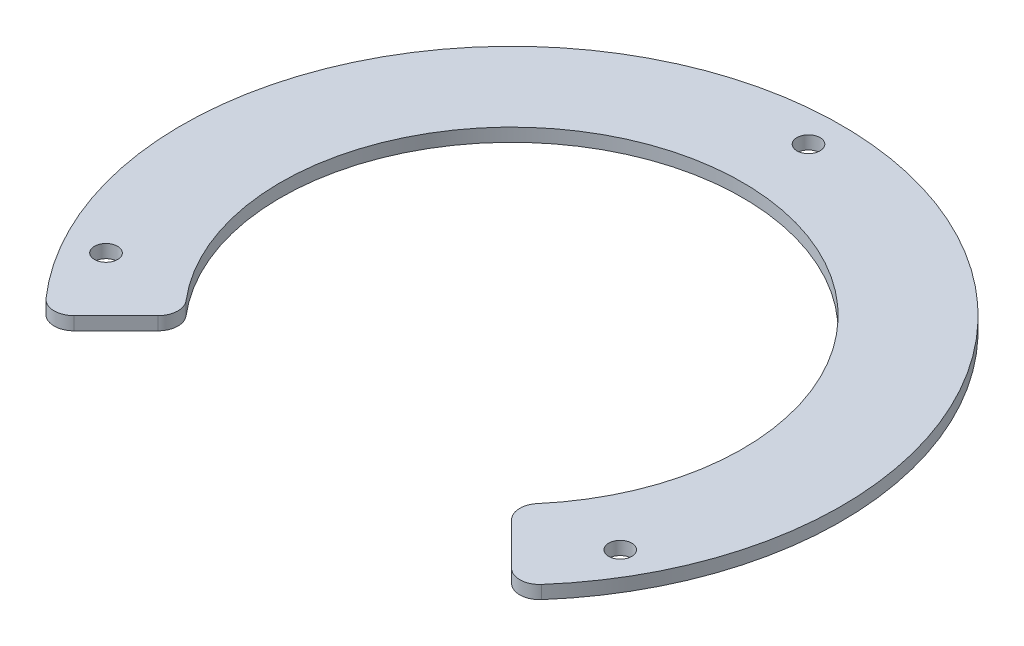
ISO-10303-21;
HEADER;
FILE_DESCRIPTION(('STEP AP214'),'2;1');
FILE_NAME('part.step','',(''),(''),'','','');
FILE_SCHEMA(('AUTOMOTIVE_DESIGN { 1 0 10303 214 1 1 1 1 }'));
ENDSEC;
DATA;
#1=APPLICATION_CONTEXT('core data for automotive mechanical design processes');
#2=APPLICATION_PROTOCOL_DEFINITION('international standard','automotive_design',2000,#1);
#3=PRODUCT_CONTEXT('',#1,'mechanical');
#4=PRODUCT('Part','Part','',(#3));
#5=PRODUCT_RELATED_PRODUCT_CATEGORY('part','',(#4));
#6=PRODUCT_DEFINITION_FORMATION('','',#4);
#7=PRODUCT_DEFINITION_CONTEXT('part definition',#1,'design');
#8=PRODUCT_DEFINITION('design','',#6,#7);
#9=PRODUCT_DEFINITION_SHAPE('','',#8);
#10=(LENGTH_UNIT() NAMED_UNIT(*) SI_UNIT(.MILLI.,.METRE.));
#11=(NAMED_UNIT(*) PLANE_ANGLE_UNIT() SI_UNIT($,.RADIAN.));
#12=(NAMED_UNIT(*) SI_UNIT($,.STERADIAN.) SOLID_ANGLE_UNIT());
#13=UNCERTAINTY_MEASURE_WITH_UNIT(LENGTH_MEASURE(1.E-05),#10,'distance_accuracy_value','');
#14=(GEOMETRIC_REPRESENTATION_CONTEXT(3) GLOBAL_UNCERTAINTY_ASSIGNED_CONTEXT((#13)) GLOBAL_UNIT_ASSIGNED_CONTEXT((#10,
#11,#12)) REPRESENTATION_CONTEXT('',''));
#15=CARTESIAN_POINT('',(0.,0.,0.));
#16=DIRECTION('',(0.,0.,1.));
#17=DIRECTION('',(1.,0.,0.));
#18=AXIS2_PLACEMENT_3D('',#15,#16,#17);
#19=CARTESIAN_POINT('',(0.,2.,0.));
#20=DIRECTION('',(0.,1.,0.));
#21=DIRECTION('',(0.,0.,1.));
#22=AXIS2_PLACEMENT_3D('',#19,#20,#21);
#23=PLANE('',#22);
#24=DIRECTION('',(-0.707106781186546,0.,0.707106781186549));
#25=VECTOR('',#24,1.);
#26=CARTESIAN_POINT('',(0.,2.,0.));
#27=LINE('',#26,#25);
#28=CARTESIAN_POINT('',(-26.7861904719577,2.,26.7861904719578));
#29=VERTEX_POINT('',#28);
#30=CARTESIAN_POINT('',(-33.166247903554,2.,33.1662479035541));
#31=VERTEX_POINT('',#30);
#32=EDGE_CURVE('E121',#29,#31,#27,.T.);
#33=ORIENTED_EDGE('',*,*,#32,.F.);
#34=CARTESIAN_POINT('',(-28.9075108155174,2.,24.6648701283982));
#35=DIRECTION('',(0.,1.,0.));
#36=DIRECTION('',(0.,0.,1.));
#37=AXIS2_PLACEMENT_3D('',#34,#35,#36);
#38=CIRCLE('',#37,3.);
#39=CARTESIAN_POINT('',(-26.6253389090291,2.,22.7176435393141));
#40=VERTEX_POINT('',#39);
#41=EDGE_CURVE('E124',#29,#40,#38,.T.);
#42=ORIENTED_EDGE('',*,*,#41,.T.);
#43=CARTESIAN_POINT('',(0.,2.,0.));
#44=DIRECTION('',(0.,1.,0.));
#45=DIRECTION('',(0.,0.,1.));
#46=AXIS2_PLACEMENT_3D('',#43,#44,#45);
#47=CIRCLE('',#46,35.);
#48=CARTESIAN_POINT('',(26.6253389090291,2.,22.7176435393141));
#49=VERTEX_POINT('',#48);
#50=EDGE_CURVE('E176',#49,#40,#47,.T.);
#51=ORIENTED_EDGE('',*,*,#50,.F.);
#52=CARTESIAN_POINT('',(28.9075108155174,2.,24.6648701283982));
#53=DIRECTION('',(0.,1.,0.));
#54=DIRECTION('',(0.,0.,1.));
#55=AXIS2_PLACEMENT_3D('',#52,#53,#54);
#56=CIRCLE('',#55,3.);
#57=CARTESIAN_POINT('',(26.7861904719577,2.,26.7861904719578));
#58=VERTEX_POINT('',#57);
#59=EDGE_CURVE('E125',#49,#58,#56,.T.);
#60=ORIENTED_EDGE('',*,*,#59,.T.);
#61=DIRECTION('',(-0.707106781186546,0.,-0.707106781186549));
#62=VECTOR('',#61,1.);
#63=CARTESIAN_POINT('',(49.9999999999998,2.,50.));
#64=LINE('',#63,#62);
#65=CARTESIAN_POINT('',(33.1662479035539,2.,33.1662479035541));
#66=VERTEX_POINT('',#65);
#67=EDGE_CURVE('E153',#66,#58,#64,.T.);
#68=ORIENTED_EDGE('',*,*,#67,.F.);
#69=CARTESIAN_POINT('',(35.2875682471136,2.,31.0449275599944));
#70=DIRECTION('',(0.,1.,0.));
#71=DIRECTION('',(0.,0.,1.));
#72=AXIS2_PLACEMENT_3D('',#69,#70,#71);
#73=CIRCLE('',#72,3.);
#74=CARTESIAN_POINT('',(37.5399662203336,2.,33.0265186808451));
#75=VERTEX_POINT('',#74);
#76=EDGE_CURVE('E127',#66,#75,#73,.T.);
#77=ORIENTED_EDGE('',*,*,#76,.T.);
#78=CARTESIAN_POINT('',(0.,2.,0.));
#79=DIRECTION('',(0.,1.,0.));
#80=DIRECTION('',(0.,0.,1.));
#81=AXIS2_PLACEMENT_3D('',#78,#79,#80);
#82=CIRCLE('',#81,50.);
#83=CARTESIAN_POINT('',(-37.5399662203336,2.,33.0265186808451));
#84=VERTEX_POINT('',#83);
#85=EDGE_CURVE('E129',#75,#84,#82,.T.);
#86=ORIENTED_EDGE('',*,*,#85,.T.);
#87=CARTESIAN_POINT('',(-35.2875682471136,2.,31.0449275599944));
#88=DIRECTION('',(0.,1.,0.));
#89=DIRECTION('',(0.,0.,1.));
#90=AXIS2_PLACEMENT_3D('',#87,#88,#89);
#91=CIRCLE('',#90,3.);
#92=EDGE_CURVE('E134',#84,#31,#91,.T.);
#93=ORIENTED_EDGE('',*,*,#92,.T.);
#94=EDGE_LOOP('',(#33,#42,#51,#60,#68,#77,#86,#93));
#95=FACE_BOUND('',#94,.T.);
#96=CARTESIAN_POINT('',(38.9711431703026,2.,22.4999999999983));
#97=DIRECTION('',(0.,1.,0.));
#98=DIRECTION('',(0.,0.,1.));
#99=AXIS2_PLACEMENT_3D('',#96,#97,#98);
#100=CIRCLE('',#99,1.75000000000246);
#101=CARTESIAN_POINT('',(38.9711431703026,2.,24.2500000000008));
#102=VERTEX_POINT('',#101);
#103=EDGE_CURVE('E165',#102,#102,#100,.T.);
#104=ORIENTED_EDGE('',*,*,#103,.F.);
#105=EDGE_LOOP('',(#104));
#106=FACE_BOUND('',#105,.T.);
#107=CARTESIAN_POINT('',(0.,2.,-45.));
#108=DIRECTION('',(0.,1.,0.));
#109=DIRECTION('',(0.,0.,1.));
#110=AXIS2_PLACEMENT_3D('',#107,#108,#109);
#111=CIRCLE('',#110,1.75);
#112=CARTESIAN_POINT('',(0.,2.,-43.25));
#113=VERTEX_POINT('',#112);
#114=EDGE_CURVE('E171',#113,#113,#111,.T.);
#115=ORIENTED_EDGE('',*,*,#114,.F.);
#116=EDGE_LOOP('',(#115));
#117=FACE_BOUND('',#116,.T.);
#118=CARTESIAN_POINT('',(-38.9711431702969,2.,22.5000000000017));
#119=DIRECTION('',(0.,1.,0.));
#120=DIRECTION('',(0.,0.,1.));
#121=AXIS2_PLACEMENT_3D('',#118,#119,#120);
#122=CIRCLE('',#121,1.75000000000364);
#123=CARTESIAN_POINT('',(-38.9711431702969,2.,24.2500000000053));
#124=VERTEX_POINT('',#123);
#125=EDGE_CURVE('E158',#124,#124,#122,.T.);
#126=ORIENTED_EDGE('',*,*,#125,.F.);
#127=EDGE_LOOP('',(#126));
#128=FACE_BOUND('',#127,.T.);
#129=ADVANCED_FACE('F32',(#95,#106,#117,#128),#23,.T.);
#130=CARTESIAN_POINT('',(0.,0.,0.));
#131=DIRECTION('',(0.,1.,0.));
#132=DIRECTION('',(0.,0.,1.));
#133=AXIS2_PLACEMENT_3D('',#130,#131,#132);
#134=PLANE('',#133);
#135=CARTESIAN_POINT('',(0.,0.,0.));
#136=DIRECTION('',(0.,1.,0.));
#137=DIRECTION('',(0.,0.,1.));
#138=AXIS2_PLACEMENT_3D('',#135,#136,#137);
#139=CIRCLE('',#138,35.);
#140=CARTESIAN_POINT('',(26.6253389090291,0.,22.7176435393141));
#141=VERTEX_POINT('',#140);
#142=CARTESIAN_POINT('',(-26.6253389090291,0.,22.7176435393141));
#143=VERTEX_POINT('',#142);
#144=EDGE_CURVE('E105',#141,#143,#139,.T.);
#145=ORIENTED_EDGE('',*,*,#144,.T.);
#146=CARTESIAN_POINT('',(-28.9075108155174,0.,24.6648701283982));
#147=DIRECTION('',(0.,1.,0.));
#148=DIRECTION('',(0.,0.,1.));
#149=AXIS2_PLACEMENT_3D('',#146,#147,#148);
#150=CIRCLE('',#149,3.);
#151=CARTESIAN_POINT('',(-26.7861904719577,0.,26.7861904719578));
#152=VERTEX_POINT('',#151);
#153=EDGE_CURVE('E98',#143,#152,#150,.F.);
#154=ORIENTED_EDGE('',*,*,#153,.T.);
#155=DIRECTION('',(-0.707106781186546,0.,0.707106781186549));
#156=VECTOR('',#155,1.);
#157=CARTESIAN_POINT('',(0.,0.,0.));
#158=LINE('',#157,#156);
#159=CARTESIAN_POINT('',(-33.166247903554,0.,33.1662479035541));
#160=VERTEX_POINT('',#159);
#161=EDGE_CURVE('E102',#152,#160,#158,.T.);
#162=ORIENTED_EDGE('',*,*,#161,.T.);
#163=CARTESIAN_POINT('',(-35.2875682471136,0.,31.0449275599944));
#164=DIRECTION('',(0.,1.,0.));
#165=DIRECTION('',(0.,0.,1.));
#166=AXIS2_PLACEMENT_3D('',#163,#164,#165);
#167=CIRCLE('',#166,3.);
#168=CARTESIAN_POINT('',(-37.5399662203336,0.,33.0265186808451));
#169=VERTEX_POINT('',#168);
#170=EDGE_CURVE('E110',#160,#169,#167,.F.);
#171=ORIENTED_EDGE('',*,*,#170,.T.);
#172=CARTESIAN_POINT('',(0.,0.,0.));
#173=DIRECTION('',(0.,1.,0.));
#174=DIRECTION('',(0.,0.,1.));
#175=AXIS2_PLACEMENT_3D('',#172,#173,#174);
#176=CIRCLE('',#175,50.);
#177=CARTESIAN_POINT('',(37.5399662203336,0.,33.0265186808451));
#178=VERTEX_POINT('',#177);
#179=EDGE_CURVE('E179',#178,#169,#176,.T.);
#180=ORIENTED_EDGE('',*,*,#179,.F.);
#181=CARTESIAN_POINT('',(35.2875682471136,0.,31.0449275599944));
#182=DIRECTION('',(0.,1.,0.));
#183=DIRECTION('',(0.,0.,1.));
#184=AXIS2_PLACEMENT_3D('',#181,#182,#183);
#185=CIRCLE('',#184,3.);
#186=CARTESIAN_POINT('',(33.166247903554,0.,33.1662479035541));
#187=VERTEX_POINT('',#186);
#188=EDGE_CURVE('E55',#178,#187,#185,.F.);
#189=ORIENTED_EDGE('',*,*,#188,.T.);
#190=DIRECTION('',(-0.707106781186546,0.,-0.707106781186549));
#191=VECTOR('',#190,1.);
#192=CARTESIAN_POINT('',(0.,0.,0.));
#193=LINE('',#192,#191);
#194=CARTESIAN_POINT('',(26.7861904719577,0.,26.7861904719578));
#195=VERTEX_POINT('',#194);
#196=EDGE_CURVE('E120',#187,#195,#193,.T.);
#197=ORIENTED_EDGE('',*,*,#196,.T.);
#198=CARTESIAN_POINT('',(28.9075108155174,0.,24.6648701283982));
#199=DIRECTION('',(0.,1.,0.));
#200=DIRECTION('',(0.,0.,1.));
#201=AXIS2_PLACEMENT_3D('',#198,#199,#200);
#202=CIRCLE('',#201,3.);
#203=EDGE_CURVE('E47',#195,#141,#202,.F.);
#204=ORIENTED_EDGE('',*,*,#203,.T.);
#205=EDGE_LOOP('',(#145,#154,#162,#171,#180,#189,#197,#204));
#206=FACE_BOUND('',#205,.T.);
#207=CARTESIAN_POINT('',(0.,0.,-45.));
#208=DIRECTION('',(0.,1.,0.));
#209=DIRECTION('',(0.,0.,1.));
#210=AXIS2_PLACEMENT_3D('',#207,#208,#209);
#211=CIRCLE('',#210,1.75);
#212=CARTESIAN_POINT('',(0.,0.,-43.25));
#213=VERTEX_POINT('',#212);
#214=EDGE_CURVE('E168',#213,#213,#211,.T.);
#215=ORIENTED_EDGE('',*,*,#214,.T.);
#216=EDGE_LOOP('',(#215));
#217=FACE_BOUND('',#216,.T.);
#218=CARTESIAN_POINT('',(38.9711431703026,0.,22.4999999999983));
#219=DIRECTION('',(0.,1.,0.));
#220=DIRECTION('',(0.,0.,1.));
#221=AXIS2_PLACEMENT_3D('',#218,#219,#220);
#222=CIRCLE('',#221,1.75000000000246);
#223=CARTESIAN_POINT('',(38.9711431703026,0.,24.2500000000008));
#224=VERTEX_POINT('',#223);
#225=EDGE_CURVE('E163',#224,#224,#222,.T.);
#226=ORIENTED_EDGE('',*,*,#225,.T.);
#227=EDGE_LOOP('',(#226));
#228=FACE_BOUND('',#227,.T.);
#229=CARTESIAN_POINT('',(-38.9711431702969,0.,22.5000000000017));
#230=DIRECTION('',(0.,1.,0.));
#231=DIRECTION('',(0.,0.,1.));
#232=AXIS2_PLACEMENT_3D('',#229,#230,#231);
#233=CIRCLE('',#232,1.75000000000364);
#234=CARTESIAN_POINT('',(-38.9711431702969,0.,24.2500000000053));
#235=VERTEX_POINT('',#234);
#236=EDGE_CURVE('E155',#235,#235,#233,.T.);
#237=ORIENTED_EDGE('',*,*,#236,.T.);
#238=EDGE_LOOP('',(#237));
#239=FACE_BOUND('',#238,.T.);
#240=ADVANCED_FACE('F100',(#206,#217,#228,#239),#134,.F.);
#241=CARTESIAN_POINT('',(0.,2.,0.));
#242=DIRECTION('',(0.,-1.,0.));
#243=DIRECTION('',(0.,0.,-1.));
#244=AXIS2_PLACEMENT_3D('',#241,#242,#243);
#245=CYLINDRICAL_SURFACE('',#244,50.);
#246=ORIENTED_EDGE('',*,*,#179,.T.);
#247=DIRECTION('',(0.,-1.,0.));
#248=VECTOR('',#247,1.);
#249=CARTESIAN_POINT('',(-37.5399662203336,2.,33.0265186808451));
#250=LINE('',#249,#248);
#251=EDGE_CURVE('E146',#169,#84,#250,.F.);
#252=ORIENTED_EDGE('',*,*,#251,.T.);
#253=ORIENTED_EDGE('',*,*,#85,.F.);
#254=DIRECTION('',(0.,-1.,0.));
#255=VECTOR('',#254,1.);
#256=CARTESIAN_POINT('',(37.5399662203336,2.,33.0265186808451));
#257=LINE('',#256,#255);
#258=EDGE_CURVE('E109',#75,#178,#257,.T.);
#259=ORIENTED_EDGE('',*,*,#258,.T.);
#260=EDGE_LOOP('',(#246,#252,#253,#259));
#261=FACE_BOUND('',#260,.T.);
#262=ADVANCED_FACE('F185',(#261),#245,.T.);
#263=CARTESIAN_POINT('',(0.,2.,0.));
#264=DIRECTION('',(0.,-1.,0.));
#265=DIRECTION('',(0.,0.,-1.));
#266=AXIS2_PLACEMENT_3D('',#263,#264,#265);
#267=CYLINDRICAL_SURFACE('',#266,35.);
#268=ORIENTED_EDGE('',*,*,#50,.T.);
#269=DIRECTION('',(0.,-1.,0.));
#270=VECTOR('',#269,1.);
#271=CARTESIAN_POINT('',(-26.6253389090291,2.,22.7176435393141));
#272=LINE('',#271,#270);
#273=EDGE_CURVE('E139',#40,#143,#272,.T.);
#274=ORIENTED_EDGE('',*,*,#273,.T.);
#275=ORIENTED_EDGE('',*,*,#144,.F.);
#276=DIRECTION('',(0.,-1.,0.));
#277=VECTOR('',#276,1.);
#278=CARTESIAN_POINT('',(26.6253389090291,2.,22.7176435393141));
#279=LINE('',#278,#277);
#280=EDGE_CURVE('E137',#141,#49,#279,.F.);
#281=ORIENTED_EDGE('',*,*,#280,.T.);
#282=EDGE_LOOP('',(#268,#274,#275,#281));
#283=FACE_BOUND('',#282,.T.);
#284=ADVANCED_FACE('F198',(#283),#267,.F.);
#285=CARTESIAN_POINT('',(0.,2.,-45.));
#286=DIRECTION('',(0.,-1.,0.));
#287=DIRECTION('',(0.,0.,-1.));
#288=AXIS2_PLACEMENT_3D('',#285,#286,#287);
#289=CYLINDRICAL_SURFACE('',#288,1.75);
#290=ORIENTED_EDGE('',*,*,#114,.T.);
#291=EDGE_LOOP('',(#290));
#292=FACE_BOUND('',#291,.T.);
#293=ORIENTED_EDGE('',*,*,#214,.F.);
#294=EDGE_LOOP('',(#293));
#295=FACE_BOUND('',#294,.T.);
#296=ADVANCED_FACE('F200',(#292,#295),#289,.F.);
#297=CARTESIAN_POINT('',(38.9711431703026,2.,22.4999999999983));
#298=DIRECTION('',(0.,-1.,0.));
#299=DIRECTION('',(0.,0.,-1.));
#300=AXIS2_PLACEMENT_3D('',#297,#298,#299);
#301=CYLINDRICAL_SURFACE('',#300,1.75000000000246);
#302=ORIENTED_EDGE('',*,*,#103,.T.);
#303=EDGE_LOOP('',(#302));
#304=FACE_BOUND('',#303,.T.);
#305=ORIENTED_EDGE('',*,*,#225,.F.);
#306=EDGE_LOOP('',(#305));
#307=FACE_BOUND('',#306,.T.);
#308=ADVANCED_FACE('F206',(#304,#307),#301,.F.);
#309=CARTESIAN_POINT('',(-38.9711431702969,2.,22.5000000000017));
#310=DIRECTION('',(0.,-1.,0.));
#311=DIRECTION('',(0.,0.,-1.));
#312=AXIS2_PLACEMENT_3D('',#309,#310,#311);
#313=CYLINDRICAL_SURFACE('',#312,1.75000000000364);
#314=ORIENTED_EDGE('',*,*,#125,.T.);
#315=EDGE_LOOP('',(#314));
#316=FACE_BOUND('',#315,.T.);
#317=ORIENTED_EDGE('',*,*,#236,.F.);
#318=EDGE_LOOP('',(#317));
#319=FACE_BOUND('',#318,.T.);
#320=ADVANCED_FACE('F258',(#316,#319),#313,.F.);
#321=CARTESIAN_POINT('',(0.,-12.,0.));
#322=DIRECTION('',(-0.707106781186549,0.,-0.707106781186546));
#323=DIRECTION('',(-0.707106781186546,0.,0.707106781186549));
#324=AXIS2_PLACEMENT_3D('',#321,#322,#323);
#325=PLANE('',#324);
#326=ORIENTED_EDGE('',*,*,#161,.F.);
#327=DIRECTION('',(0.,1.,0.));
#328=VECTOR('',#327,1.);
#329=CARTESIAN_POINT('',(-26.7861904719577,2.,26.7861904719578));
#330=LINE('',#329,#328);
#331=EDGE_CURVE('E116',#152,#29,#330,.T.);
#332=ORIENTED_EDGE('',*,*,#331,.T.);
#333=ORIENTED_EDGE('',*,*,#32,.T.);
#334=DIRECTION('',(0.,-1.,0.));
#335=VECTOR('',#334,1.);
#336=CARTESIAN_POINT('',(-33.166247903554,-12.,33.1662479035541));
#337=LINE('',#336,#335);
#338=EDGE_CURVE('E119',#31,#160,#337,.T.);
#339=ORIENTED_EDGE('',*,*,#338,.T.);
#340=EDGE_LOOP('',(#326,#332,#333,#339));
#341=FACE_BOUND('',#340,.T.);
#342=ADVANCED_FACE('F114',(#341),#325,.F.);
#343=CARTESIAN_POINT('',(49.9999999999998,-12.,50.));
#344=DIRECTION('',(0.707106781186549,0.,-0.707106781186546));
#345=DIRECTION('',(-0.707106781186546,0.,-0.707106781186549));
#346=AXIS2_PLACEMENT_3D('',#343,#344,#345);
#347=PLANE('',#346);
#348=ORIENTED_EDGE('',*,*,#196,.F.);
#349=DIRECTION('',(0.,-1.,0.));
#350=VECTOR('',#349,1.);
#351=CARTESIAN_POINT('',(33.1662479035539,-12.,33.1662479035541));
#352=LINE('',#351,#350);
#353=EDGE_CURVE('E11',#187,#66,#352,.F.);
#354=ORIENTED_EDGE('',*,*,#353,.T.);
#355=ORIENTED_EDGE('',*,*,#67,.T.);
#356=DIRECTION('',(0.,1.,0.));
#357=VECTOR('',#356,1.);
#358=CARTESIAN_POINT('',(26.7861904719577,0.,26.7861904719578));
#359=LINE('',#358,#357);
#360=EDGE_CURVE('E40',#58,#195,#359,.F.);
#361=ORIENTED_EDGE('',*,*,#360,.T.);
#362=EDGE_LOOP('',(#348,#354,#355,#361));
#363=FACE_BOUND('',#362,.T.);
#364=ADVANCED_FACE('F150',(#363),#347,.F.);
#365=CARTESIAN_POINT('',(-28.9075108155174,2.,24.6648701283982));
#366=DIRECTION('',(0.,-1.,0.));
#367=DIRECTION('',(0.,0.,-1.));
#368=AXIS2_PLACEMENT_3D('',#365,#366,#367);
#369=CYLINDRICAL_SURFACE('',#368,3.);
#370=ORIENTED_EDGE('',*,*,#153,.F.);
#371=ORIENTED_EDGE('',*,*,#273,.F.);
#372=ORIENTED_EDGE('',*,*,#41,.F.);
#373=ORIENTED_EDGE('',*,*,#331,.F.);
#374=EDGE_LOOP('',(#370,#371,#372,#373));
#375=FACE_BOUND('',#374,.T.);
#376=ADVANCED_FACE('F123',(#375),#369,.T.);
#377=CARTESIAN_POINT('',(-35.2875682471136,2.,31.0449275599944));
#378=DIRECTION('',(0.,-1.,0.));
#379=DIRECTION('',(0.,0.,-1.));
#380=AXIS2_PLACEMENT_3D('',#377,#378,#379);
#381=CYLINDRICAL_SURFACE('',#380,3.);
#382=ORIENTED_EDGE('',*,*,#170,.F.);
#383=ORIENTED_EDGE('',*,*,#338,.F.);
#384=ORIENTED_EDGE('',*,*,#92,.F.);
#385=ORIENTED_EDGE('',*,*,#251,.F.);
#386=EDGE_LOOP('',(#382,#383,#384,#385));
#387=FACE_BOUND('',#386,.T.);
#388=ADVANCED_FACE('F189',(#387),#381,.T.);
#389=CARTESIAN_POINT('',(35.2875682471136,2.,31.0449275599944));
#390=DIRECTION('',(0.,-1.,0.));
#391=DIRECTION('',(0.,0.,-1.));
#392=AXIS2_PLACEMENT_3D('',#389,#390,#391);
#393=CYLINDRICAL_SURFACE('',#392,3.);
#394=ORIENTED_EDGE('',*,*,#76,.F.);
#395=ORIENTED_EDGE('',*,*,#353,.F.);
#396=ORIENTED_EDGE('',*,*,#188,.F.);
#397=ORIENTED_EDGE('',*,*,#258,.F.);
#398=EDGE_LOOP('',(#394,#395,#396,#397));
#399=FACE_BOUND('',#398,.T.);
#400=ADVANCED_FACE('F195',(#399),#393,.T.);
#401=CARTESIAN_POINT('',(28.9075108155174,2.,24.6648701283982));
#402=DIRECTION('',(0.,-1.,0.));
#403=DIRECTION('',(0.,0.,-1.));
#404=AXIS2_PLACEMENT_3D('',#401,#402,#403);
#405=CYLINDRICAL_SURFACE('',#404,3.);
#406=ORIENTED_EDGE('',*,*,#59,.F.);
#407=ORIENTED_EDGE('',*,*,#280,.F.);
#408=ORIENTED_EDGE('',*,*,#203,.F.);
#409=ORIENTED_EDGE('',*,*,#360,.F.);
#410=EDGE_LOOP('',(#406,#407,#408,#409));
#411=FACE_BOUND('',#410,.T.);
#412=ADVANCED_FACE('F34',(#411),#405,.T.);
#413=CLOSED_SHELL('',(#129,#240,#262,#284,#296,#308,#320,#342,#364,#376,#388,#400,#412));
#414=MANIFOLD_SOLID_BREP('B2',#413);
#415=ADVANCED_BREP_SHAPE_REPRESENTATION('',(#18,#414),#14);
#416=SHAPE_DEFINITION_REPRESENTATION(#9,#415);
ENDSEC;
END-ISO-10303-21;
